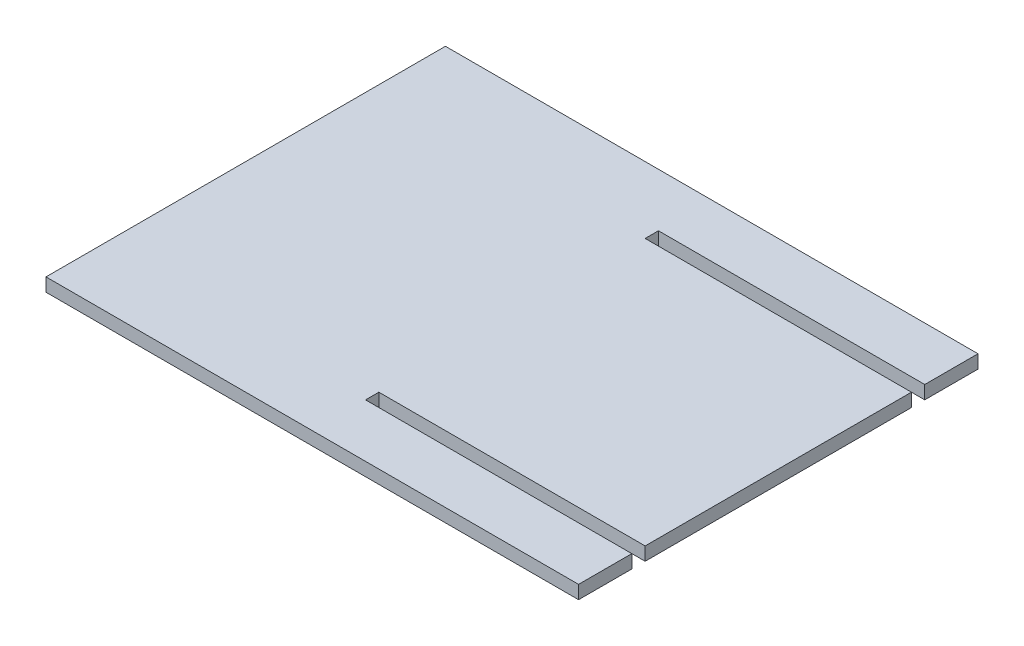
ISO-10303-21;
HEADER;
FILE_DESCRIPTION(('STEP AP214'),'2;1');
FILE_NAME('part.step','',(''),(''),'','','');
FILE_SCHEMA(('AUTOMOTIVE_DESIGN { 1 0 10303 214 1 1 1 1 }'));
ENDSEC;
DATA;
#1=APPLICATION_CONTEXT('core data for automotive mechanical design processes');
#2=APPLICATION_PROTOCOL_DEFINITION('international standard','automotive_design',2000,#1);
#3=PRODUCT_CONTEXT('',#1,'mechanical');
#4=PRODUCT('Part','Part','',(#3));
#5=PRODUCT_RELATED_PRODUCT_CATEGORY('part','',(#4));
#6=PRODUCT_DEFINITION_FORMATION('','',#4);
#7=PRODUCT_DEFINITION_CONTEXT('part definition',#1,'design');
#8=PRODUCT_DEFINITION('design','',#6,#7);
#9=PRODUCT_DEFINITION_SHAPE('','',#8);
#10=(LENGTH_UNIT() NAMED_UNIT(*) SI_UNIT(.MILLI.,.METRE.));
#11=(NAMED_UNIT(*) PLANE_ANGLE_UNIT() SI_UNIT($,.RADIAN.));
#12=(NAMED_UNIT(*) SI_UNIT($,.STERADIAN.) SOLID_ANGLE_UNIT());
#13=UNCERTAINTY_MEASURE_WITH_UNIT(LENGTH_MEASURE(1.E-05),#10,'distance_accuracy_value','');
#14=(GEOMETRIC_REPRESENTATION_CONTEXT(3) GLOBAL_UNCERTAINTY_ASSIGNED_CONTEXT((#13)) GLOBAL_UNIT_ASSIGNED_CONTEXT((#10,
#11,#12)) REPRESENTATION_CONTEXT('',''));
#15=CARTESIAN_POINT('',(0.,0.,0.));
#16=DIRECTION('',(0.,0.,1.));
#17=DIRECTION('',(1.,0.,0.));
#18=AXIS2_PLACEMENT_3D('',#15,#16,#17);
#19=CARTESIAN_POINT('',(0.,3.,33.));
#20=DIRECTION('',(0.,0.,-1.));
#21=DIRECTION('',(-1.,0.,0.));
#22=AXIS2_PLACEMENT_3D('',#19,#20,#21);
#23=PLANE('',#22);
#24=DIRECTION('',(1.,0.,0.));
#25=VECTOR('',#24,1.);
#26=CARTESIAN_POINT('',(0.,0.,33.));
#27=LINE('',#26,#25);
#28=CARTESIAN_POINT('',(0.,0.,33.));
#29=VERTEX_POINT('',#28);
#30=CARTESIAN_POINT('',(60.,0.,33.));
#31=VERTEX_POINT('',#30);
#32=EDGE_CURVE('E231',#29,#31,#27,.T.);
#33=ORIENTED_EDGE('',*,*,#32,.F.);
#34=DIRECTION('',(0.,-1.,0.));
#35=VECTOR('',#34,1.);
#36=CARTESIAN_POINT('',(0.,3.,33.));
#37=LINE('',#36,#35);
#38=CARTESIAN_POINT('',(0.,3.,33.));
#39=VERTEX_POINT('',#38);
#40=EDGE_CURVE('E12',#39,#29,#37,.T.);
#41=ORIENTED_EDGE('',*,*,#40,.F.);
#42=DIRECTION('',(1.,0.,0.));
#43=VECTOR('',#42,1.);
#44=CARTESIAN_POINT('',(0.,3.,33.));
#45=LINE('',#44,#43);
#46=CARTESIAN_POINT('',(60.,3.,33.));
#47=VERTEX_POINT('',#46);
#48=EDGE_CURVE('E250',#39,#47,#45,.T.);
#49=ORIENTED_EDGE('',*,*,#48,.T.);
#50=DIRECTION('',(0.,-1.,0.));
#51=VECTOR('',#50,1.);
#52=CARTESIAN_POINT('',(60.,3.,33.));
#53=LINE('',#52,#51);
#54=EDGE_CURVE('E100',#47,#31,#53,.T.);
#55=ORIENTED_EDGE('',*,*,#54,.T.);
#56=EDGE_LOOP('',(#33,#41,#49,#55));
#57=FACE_BOUND('',#56,.T.);
#58=ADVANCED_FACE('F38',(#57),#23,.T.);
#59=CARTESIAN_POINT('',(0.,3.,0.));
#60=DIRECTION('',(1.,0.,0.));
#61=DIRECTION('',(0.,0.,-1.));
#62=AXIS2_PLACEMENT_3D('',#59,#60,#61);
#63=PLANE('',#62);
#64=DIRECTION('',(0.,0.,1.));
#65=VECTOR('',#64,1.);
#66=CARTESIAN_POINT('',(0.,0.,0.));
#67=LINE('',#66,#65);
#68=CARTESIAN_POINT('',(0.,0.,30.));
#69=VERTEX_POINT('',#68);
#70=EDGE_CURVE('E227',#69,#29,#67,.T.);
#71=ORIENTED_EDGE('',*,*,#70,.F.);
#72=DIRECTION('',(0.,-1.,0.));
#73=VECTOR('',#72,1.);
#74=CARTESIAN_POINT('',(0.,3.,30.));
#75=LINE('',#74,#73);
#76=CARTESIAN_POINT('',(0.,3.,30.));
#77=VERTEX_POINT('',#76);
#78=EDGE_CURVE('E46',#77,#69,#75,.T.);
#79=ORIENTED_EDGE('',*,*,#78,.F.);
#80=DIRECTION('',(0.,0.,1.));
#81=VECTOR('',#80,1.);
#82=CARTESIAN_POINT('',(0.,3.,0.));
#83=LINE('',#82,#81);
#84=EDGE_CURVE('E254',#77,#39,#83,.T.);
#85=ORIENTED_EDGE('',*,*,#84,.T.);
#86=ORIENTED_EDGE('',*,*,#40,.T.);
#87=EDGE_LOOP('',(#71,#79,#85,#86));
#88=FACE_BOUND('',#87,.T.);
#89=ADVANCED_FACE('F228',(#88),#63,.T.);
#90=CARTESIAN_POINT('',(0.,3.,30.));
#91=DIRECTION('',(0.,0.,1.));
#92=DIRECTION('',(1.,0.,0.));
#93=AXIS2_PLACEMENT_3D('',#90,#91,#92);
#94=PLANE('',#93);
#95=DIRECTION('',(-1.,0.,0.));
#96=VECTOR('',#95,1.);
#97=CARTESIAN_POINT('',(0.,0.,30.));
#98=LINE('',#97,#96);
#99=CARTESIAN_POINT('',(60.,0.,30.));
#100=VERTEX_POINT('',#99);
#101=EDGE_CURVE('E221',#100,#69,#98,.T.);
#102=ORIENTED_EDGE('',*,*,#101,.F.);
#103=DIRECTION('',(0.,-1.,0.));
#104=VECTOR('',#103,1.);
#105=CARTESIAN_POINT('',(60.,3.,30.));
#106=LINE('',#105,#104);
#107=CARTESIAN_POINT('',(60.,3.,30.));
#108=VERTEX_POINT('',#107);
#109=EDGE_CURVE('E214',#108,#100,#106,.T.);
#110=ORIENTED_EDGE('',*,*,#109,.F.);
#111=DIRECTION('',(-1.,0.,0.));
#112=VECTOR('',#111,1.);
#113=CARTESIAN_POINT('',(0.,3.,30.));
#114=LINE('',#113,#112);
#115=EDGE_CURVE('E171',#108,#77,#114,.T.);
#116=ORIENTED_EDGE('',*,*,#115,.T.);
#117=ORIENTED_EDGE('',*,*,#78,.T.);
#118=EDGE_LOOP('',(#102,#110,#116,#117));
#119=FACE_BOUND('',#118,.T.);
#120=ADVANCED_FACE('F219',(#119),#94,.T.);
#121=CARTESIAN_POINT('',(60.,3.,0.));
#122=DIRECTION('',(-1.,0.,0.));
#123=DIRECTION('',(0.,0.,1.));
#124=AXIS2_PLACEMENT_3D('',#121,#122,#123);
#125=PLANE('',#124);
#126=DIRECTION('',(0.,0.,-1.));
#127=VECTOR('',#126,1.);
#128=CARTESIAN_POINT('',(60.,0.,0.));
#129=LINE('',#128,#127);
#130=CARTESIAN_POINT('',(60.,0.,-30.));
#131=VERTEX_POINT('',#130);
#132=EDGE_CURVE('E236',#100,#131,#129,.T.);
#133=ORIENTED_EDGE('',*,*,#132,.T.);
#134=DIRECTION('',(0.,-1.,0.));
#135=VECTOR('',#134,1.);
#136=CARTESIAN_POINT('',(60.,3.,-30.));
#137=LINE('',#136,#135);
#138=CARTESIAN_POINT('',(60.,3.,-30.));
#139=VERTEX_POINT('',#138);
#140=EDGE_CURVE('E211',#139,#131,#137,.T.);
#141=ORIENTED_EDGE('',*,*,#140,.F.);
#142=DIRECTION('',(0.,0.,-1.));
#143=VECTOR('',#142,1.);
#144=CARTESIAN_POINT('',(60.,3.,0.));
#145=LINE('',#144,#143);
#146=EDGE_CURVE('E165',#108,#139,#145,.T.);
#147=ORIENTED_EDGE('',*,*,#146,.F.);
#148=ORIENTED_EDGE('',*,*,#109,.T.);
#149=EDGE_LOOP('',(#133,#141,#147,#148));
#150=FACE_BOUND('',#149,.T.);
#151=ADVANCED_FACE('F274',(#150),#125,.F.);
#152=CARTESIAN_POINT('',(0.,3.,-30.));
#153=DIRECTION('',(0.,0.,1.));
#154=DIRECTION('',(1.,0.,0.));
#155=AXIS2_PLACEMENT_3D('',#152,#153,#154);
#156=PLANE('',#155);
#157=DIRECTION('',(-1.,0.,0.));
#158=VECTOR('',#157,1.);
#159=CARTESIAN_POINT('',(0.,0.,-30.));
#160=LINE('',#159,#158);
#161=CARTESIAN_POINT('',(0.,0.,-30.));
#162=VERTEX_POINT('',#161);
#163=EDGE_CURVE('E238',#131,#162,#160,.T.);
#164=ORIENTED_EDGE('',*,*,#163,.T.);
#165=DIRECTION('',(0.,-1.,0.));
#166=VECTOR('',#165,1.);
#167=CARTESIAN_POINT('',(0.,3.,-30.));
#168=LINE('',#167,#166);
#169=CARTESIAN_POINT('',(0.,3.,-30.));
#170=VERTEX_POINT('',#169);
#171=EDGE_CURVE('E208',#170,#162,#168,.T.);
#172=ORIENTED_EDGE('',*,*,#171,.F.);
#173=DIRECTION('',(-1.,0.,0.));
#174=VECTOR('',#173,1.);
#175=CARTESIAN_POINT('',(0.,3.,-30.));
#176=LINE('',#175,#174);
#177=EDGE_CURVE('E170',#139,#170,#176,.T.);
#178=ORIENTED_EDGE('',*,*,#177,.F.);
#179=ORIENTED_EDGE('',*,*,#140,.T.);
#180=EDGE_LOOP('',(#164,#172,#178,#179));
#181=FACE_BOUND('',#180,.T.);
#182=ADVANCED_FACE('F285',(#181),#156,.F.);
#183=CARTESIAN_POINT('',(0.,3.,0.));
#184=DIRECTION('',(-1.,0.,0.));
#185=DIRECTION('',(0.,0.,1.));
#186=AXIS2_PLACEMENT_3D('',#183,#184,#185);
#187=PLANE('',#186);
#188=DIRECTION('',(0.,0.,-1.));
#189=VECTOR('',#188,1.);
#190=CARTESIAN_POINT('',(0.,0.,0.));
#191=LINE('',#190,#189);
#192=CARTESIAN_POINT('',(0.,0.,-33.));
#193=VERTEX_POINT('',#192);
#194=EDGE_CURVE('E244',#162,#193,#191,.T.);
#195=ORIENTED_EDGE('',*,*,#194,.T.);
#196=DIRECTION('',(0.,-1.,0.));
#197=VECTOR('',#196,1.);
#198=CARTESIAN_POINT('',(0.,3.,-33.));
#199=LINE('',#198,#197);
#200=CARTESIAN_POINT('',(0.,3.,-33.));
#201=VERTEX_POINT('',#200);
#202=EDGE_CURVE('E205',#201,#193,#199,.T.);
#203=ORIENTED_EDGE('',*,*,#202,.F.);
#204=DIRECTION('',(0.,0.,-1.));
#205=VECTOR('',#204,1.);
#206=CARTESIAN_POINT('',(0.,3.,0.));
#207=LINE('',#206,#205);
#208=EDGE_CURVE('E182',#170,#201,#207,.T.);
#209=ORIENTED_EDGE('',*,*,#208,.F.);
#210=ORIENTED_EDGE('',*,*,#171,.T.);
#211=EDGE_LOOP('',(#195,#203,#209,#210));
#212=FACE_BOUND('',#211,.T.);
#213=ADVANCED_FACE('F288',(#212),#187,.F.);
#214=CARTESIAN_POINT('',(0.,3.,-33.));
#215=DIRECTION('',(0.,0.,-1.));
#216=DIRECTION('',(-1.,0.,0.));
#217=AXIS2_PLACEMENT_3D('',#214,#215,#216);
#218=PLANE('',#217);
#219=DIRECTION('',(1.,0.,0.));
#220=VECTOR('',#219,1.);
#221=CARTESIAN_POINT('',(0.,0.,-33.));
#222=LINE('',#221,#220);
#223=CARTESIAN_POINT('',(60.,0.,-33.));
#224=VERTEX_POINT('',#223);
#225=EDGE_CURVE('E246',#193,#224,#222,.T.);
#226=ORIENTED_EDGE('',*,*,#225,.T.);
#227=DIRECTION('',(0.,-1.,0.));
#228=VECTOR('',#227,1.);
#229=CARTESIAN_POINT('',(60.,3.,-33.));
#230=LINE('',#229,#228);
#231=CARTESIAN_POINT('',(60.,3.,-33.));
#232=VERTEX_POINT('',#231);
#233=EDGE_CURVE('E202',#232,#224,#230,.T.);
#234=ORIENTED_EDGE('',*,*,#233,.F.);
#235=DIRECTION('',(1.,0.,0.));
#236=VECTOR('',#235,1.);
#237=CARTESIAN_POINT('',(0.,3.,-33.));
#238=LINE('',#237,#236);
#239=EDGE_CURVE('E185',#201,#232,#238,.T.);
#240=ORIENTED_EDGE('',*,*,#239,.F.);
#241=ORIENTED_EDGE('',*,*,#202,.T.);
#242=EDGE_LOOP('',(#226,#234,#240,#241));
#243=FACE_BOUND('',#242,.T.);
#244=ADVANCED_FACE('F271',(#243),#218,.F.);
#245=CARTESIAN_POINT('',(60.,0.,-45.));
#246=VERTEX_POINT('',#245);
#247=EDGE_CURVE('E241',#224,#246,#129,.T.);
#248=ORIENTED_EDGE('',*,*,#247,.T.);
#249=DIRECTION('',(0.,-1.,0.));
#250=VECTOR('',#249,1.);
#251=CARTESIAN_POINT('',(60.,3.,-45.));
#252=LINE('',#251,#250);
#253=CARTESIAN_POINT('',(60.,3.,-45.));
#254=VERTEX_POINT('',#253);
#255=EDGE_CURVE('E200',#254,#246,#252,.T.);
#256=ORIENTED_EDGE('',*,*,#255,.F.);
#257=EDGE_CURVE('E153',#232,#254,#145,.T.);
#258=ORIENTED_EDGE('',*,*,#257,.F.);
#259=ORIENTED_EDGE('',*,*,#233,.T.);
#260=EDGE_LOOP('',(#248,#256,#258,#259));
#261=FACE_BOUND('',#260,.T.);
#262=ADVANCED_FACE('F259',(#261),#125,.F.);
#263=CARTESIAN_POINT('',(0.,3.,-45.));
#264=DIRECTION('',(0.,0.,-1.));
#265=DIRECTION('',(-1.,0.,0.));
#266=AXIS2_PLACEMENT_3D('',#263,#264,#265);
#267=PLANE('',#266);
#268=DIRECTION('',(1.,0.,0.));
#269=VECTOR('',#268,1.);
#270=CARTESIAN_POINT('',(0.,0.,-45.));
#271=LINE('',#270,#269);
#272=CARTESIAN_POINT('',(-60.,0.,-45.));
#273=VERTEX_POINT('',#272);
#274=EDGE_CURVE('E248',#273,#246,#271,.T.);
#275=ORIENTED_EDGE('',*,*,#274,.F.);
#276=DIRECTION('',(0.,-1.,0.));
#277=VECTOR('',#276,1.);
#278=CARTESIAN_POINT('',(-60.,3.,-45.));
#279=LINE('',#278,#277);
#280=CARTESIAN_POINT('',(-60.,3.,-45.));
#281=VERTEX_POINT('',#280);
#282=EDGE_CURVE('E139',#281,#273,#279,.T.);
#283=ORIENTED_EDGE('',*,*,#282,.F.);
#284=DIRECTION('',(1.,0.,0.));
#285=VECTOR('',#284,1.);
#286=CARTESIAN_POINT('',(0.,3.,-45.));
#287=LINE('',#286,#285);
#288=EDGE_CURVE('E149',#281,#254,#287,.T.);
#289=ORIENTED_EDGE('',*,*,#288,.T.);
#290=ORIENTED_EDGE('',*,*,#255,.T.);
#291=EDGE_LOOP('',(#275,#283,#289,#290));
#292=FACE_BOUND('',#291,.T.);
#293=ADVANCED_FACE('F263',(#292),#267,.T.);
#294=CARTESIAN_POINT('',(-60.,3.,0.));
#295=DIRECTION('',(-1.,0.,0.));
#296=DIRECTION('',(0.,0.,1.));
#297=AXIS2_PLACEMENT_3D('',#294,#295,#296);
#298=PLANE('',#297);
#299=DIRECTION('',(0.,0.,-1.));
#300=VECTOR('',#299,1.);
#301=CARTESIAN_POINT('',(-60.,0.,0.));
#302=LINE('',#301,#300);
#303=CARTESIAN_POINT('',(-60.,0.,45.));
#304=VERTEX_POINT('',#303);
#305=EDGE_CURVE('E138',#304,#273,#302,.T.);
#306=ORIENTED_EDGE('',*,*,#305,.F.);
#307=DIRECTION('',(0.,-1.,0.));
#308=VECTOR('',#307,1.);
#309=CARTESIAN_POINT('',(-60.,3.,45.));
#310=LINE('',#309,#308);
#311=CARTESIAN_POINT('',(-60.,3.,45.));
#312=VERTEX_POINT('',#311);
#313=EDGE_CURVE('E132',#312,#304,#310,.T.);
#314=ORIENTED_EDGE('',*,*,#313,.F.);
#315=DIRECTION('',(0.,0.,-1.));
#316=VECTOR('',#315,1.);
#317=CARTESIAN_POINT('',(-60.,3.,0.));
#318=LINE('',#317,#316);
#319=EDGE_CURVE('E136',#312,#281,#318,.T.);
#320=ORIENTED_EDGE('',*,*,#319,.T.);
#321=ORIENTED_EDGE('',*,*,#282,.T.);
#322=EDGE_LOOP('',(#306,#314,#320,#321));
#323=FACE_BOUND('',#322,.T.);
#324=ADVANCED_FACE('F134',(#323),#298,.T.);
#325=CARTESIAN_POINT('',(0.,3.,45.));
#326=DIRECTION('',(0.,0.,-1.));
#327=DIRECTION('',(-1.,0.,0.));
#328=AXIS2_PLACEMENT_3D('',#325,#326,#327);
#329=PLANE('',#328);
#330=DIRECTION('',(1.,0.,0.));
#331=VECTOR('',#330,1.);
#332=CARTESIAN_POINT('',(0.,0.,45.));
#333=LINE('',#332,#331);
#334=CARTESIAN_POINT('',(60.,0.,45.));
#335=VERTEX_POINT('',#334);
#336=EDGE_CURVE('E93',#304,#335,#333,.T.);
#337=ORIENTED_EDGE('',*,*,#336,.T.);
#338=DIRECTION('',(0.,-1.,0.));
#339=VECTOR('',#338,1.);
#340=CARTESIAN_POINT('',(60.,3.,45.));
#341=LINE('',#340,#339);
#342=CARTESIAN_POINT('',(60.,3.,45.));
#343=VERTEX_POINT('',#342);
#344=EDGE_CURVE('E140',#343,#335,#341,.T.);
#345=ORIENTED_EDGE('',*,*,#344,.F.);
#346=DIRECTION('',(1.,0.,0.));
#347=VECTOR('',#346,1.);
#348=CARTESIAN_POINT('',(0.,3.,45.));
#349=LINE('',#348,#347);
#350=EDGE_CURVE('E142',#312,#343,#349,.T.);
#351=ORIENTED_EDGE('',*,*,#350,.F.);
#352=ORIENTED_EDGE('',*,*,#313,.T.);
#353=EDGE_LOOP('',(#337,#345,#351,#352));
#354=FACE_BOUND('',#353,.T.);
#355=ADVANCED_FACE('F143',(#354),#329,.F.);
#356=EDGE_CURVE('E240',#335,#31,#129,.T.);
#357=ORIENTED_EDGE('',*,*,#356,.T.);
#358=ORIENTED_EDGE('',*,*,#54,.F.);
#359=EDGE_CURVE('E54',#343,#47,#145,.T.);
#360=ORIENTED_EDGE('',*,*,#359,.F.);
#361=ORIENTED_EDGE('',*,*,#344,.T.);
#362=EDGE_LOOP('',(#357,#358,#360,#361));
#363=FACE_BOUND('',#362,.T.);
#364=ADVANCED_FACE('F273',(#363),#125,.F.);
#365=CARTESIAN_POINT('',(0.,3.,0.));
#366=DIRECTION('',(0.,1.,0.));
#367=DIRECTION('',(0.,0.,1.));
#368=AXIS2_PLACEMENT_3D('',#365,#366,#367);
#369=PLANE('',#368);
#370=ORIENTED_EDGE('',*,*,#48,.F.);
#371=ORIENTED_EDGE('',*,*,#84,.F.);
#372=ORIENTED_EDGE('',*,*,#115,.F.);
#373=ORIENTED_EDGE('',*,*,#146,.T.);
#374=ORIENTED_EDGE('',*,*,#177,.T.);
#375=ORIENTED_EDGE('',*,*,#208,.T.);
#376=ORIENTED_EDGE('',*,*,#239,.T.);
#377=ORIENTED_EDGE('',*,*,#257,.T.);
#378=ORIENTED_EDGE('',*,*,#288,.F.);
#379=ORIENTED_EDGE('',*,*,#319,.F.);
#380=ORIENTED_EDGE('',*,*,#350,.T.);
#381=ORIENTED_EDGE('',*,*,#359,.T.);
#382=EDGE_LOOP('',(#370,#371,#372,#373,#374,#375,#376,#377,#378,#379,#380,#381));
#383=FACE_BOUND('',#382,.T.);
#384=ADVANCED_FACE('F147',(#383),#369,.T.);
#385=CARTESIAN_POINT('',(0.,0.,0.));
#386=DIRECTION('',(0.,1.,0.));
#387=DIRECTION('',(0.,0.,1.));
#388=AXIS2_PLACEMENT_3D('',#385,#386,#387);
#389=PLANE('',#388);
#390=ORIENTED_EDGE('',*,*,#32,.T.);
#391=ORIENTED_EDGE('',*,*,#356,.F.);
#392=ORIENTED_EDGE('',*,*,#336,.F.);
#393=ORIENTED_EDGE('',*,*,#305,.T.);
#394=ORIENTED_EDGE('',*,*,#274,.T.);
#395=ORIENTED_EDGE('',*,*,#247,.F.);
#396=ORIENTED_EDGE('',*,*,#225,.F.);
#397=ORIENTED_EDGE('',*,*,#194,.F.);
#398=ORIENTED_EDGE('',*,*,#163,.F.);
#399=ORIENTED_EDGE('',*,*,#132,.F.);
#400=ORIENTED_EDGE('',*,*,#101,.T.);
#401=ORIENTED_EDGE('',*,*,#70,.T.);
#402=EDGE_LOOP('',(#390,#391,#392,#393,#394,#395,#396,#397,#398,#399,#400,#401));
#403=FACE_BOUND('',#402,.T.);
#404=ADVANCED_FACE('F234',(#403),#389,.F.);
#405=CLOSED_SHELL('',(#58,#89,#120,#151,#182,#213,#244,#262,#293,#324,#355,#364,#384,#404));
#406=MANIFOLD_SOLID_BREP('B2',#405);
#407=ADVANCED_BREP_SHAPE_REPRESENTATION('',(#18,#406),#14);
#408=SHAPE_DEFINITION_REPRESENTATION(#9,#407);
ENDSEC;
END-ISO-10303-21;
